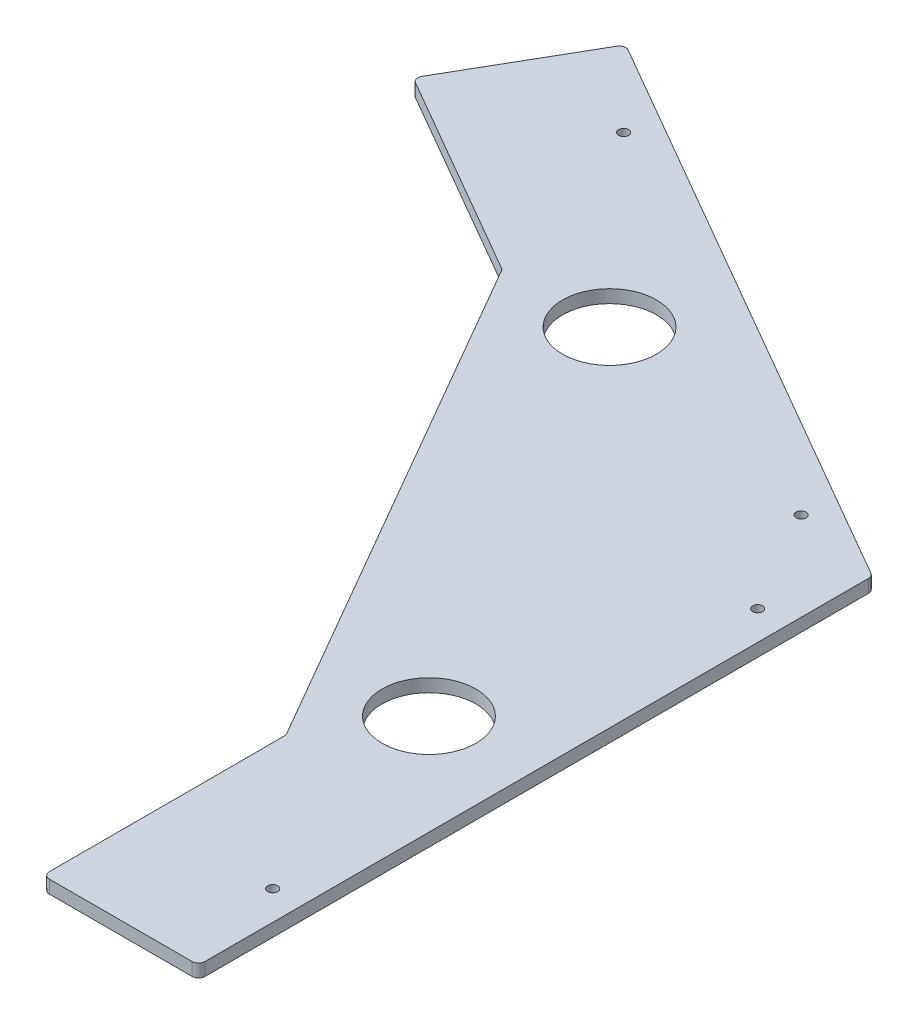
ISO-10303-21;
HEADER;
FILE_DESCRIPTION(('STEP AP214'),'2;1');
FILE_NAME('part.step','',(''),(''),'','','');
FILE_SCHEMA(('AUTOMOTIVE_DESIGN { 1 0 10303 214 1 1 1 1 }'));
ENDSEC;
DATA;
#1=APPLICATION_CONTEXT('core data for automotive mechanical design processes');
#2=APPLICATION_PROTOCOL_DEFINITION('international standard','automotive_design',2000,#1);
#3=PRODUCT_CONTEXT('',#1,'mechanical');
#4=PRODUCT('Part','Part','',(#3));
#5=PRODUCT_RELATED_PRODUCT_CATEGORY('part','',(#4));
#6=PRODUCT_DEFINITION_FORMATION('','',#4);
#7=PRODUCT_DEFINITION_CONTEXT('part definition',#1,'design');
#8=PRODUCT_DEFINITION('design','',#6,#7);
#9=PRODUCT_DEFINITION_SHAPE('','',#8);
#10=(LENGTH_UNIT() NAMED_UNIT(*) SI_UNIT(.MILLI.,.METRE.));
#11=(NAMED_UNIT(*) PLANE_ANGLE_UNIT() SI_UNIT($,.RADIAN.));
#12=(NAMED_UNIT(*) SI_UNIT($,.STERADIAN.) SOLID_ANGLE_UNIT());
#13=UNCERTAINTY_MEASURE_WITH_UNIT(LENGTH_MEASURE(1.E-05),#10,'distance_accuracy_value','');
#14=(GEOMETRIC_REPRESENTATION_CONTEXT(3) GLOBAL_UNCERTAINTY_ASSIGNED_CONTEXT((#13)) GLOBAL_UNIT_ASSIGNED_CONTEXT((#10,
#11,#12)) REPRESENTATION_CONTEXT('',''));
#15=CARTESIAN_POINT('',(0.,0.,0.));
#16=DIRECTION('',(0.,0.,1.));
#17=DIRECTION('',(1.,0.,0.));
#18=AXIS2_PLACEMENT_3D('',#15,#16,#17);
#19=CARTESIAN_POINT('',(0.,6.35,0.));
#20=DIRECTION('',(0.,1.,0.));
#21=DIRECTION('',(0.,0.,1.));
#22=AXIS2_PLACEMENT_3D('',#19,#20,#21);
#23=PLANE('',#22);
#24=CARTESIAN_POINT('',(-43.4068750823877,6.35,-338.518865913276));
#25=DIRECTION('',(0.,1.,0.));
#26=DIRECTION('',(0.,0.,1.));
#27=AXIS2_PLACEMENT_3D('',#24,#25,#26);
#28=CIRCLE('',#27,2.45744999999987);
#29=CARTESIAN_POINT('',(-43.4068750823877,6.35,-336.061415913276));
#30=VERTEX_POINT('',#29);
#31=EDGE_CURVE('E298',#30,#30,#28,.T.);
#32=ORIENTED_EDGE('',*,*,#31,.F.);
#33=EDGE_LOOP('',(#32));
#34=FACE_BOUND('',#33,.T.);
#35=CARTESIAN_POINT('',(-49.2124999999999,6.35,-162.061031219973));
#36=DIRECTION('',(0.,1.,0.));
#37=DIRECTION('',(0.,0.,1.));
#38=AXIS2_PLACEMENT_3D('',#35,#36,#37);
#39=CIRCLE('',#38,23.0187499999997);
#40=CARTESIAN_POINT('',(-49.2124999999999,6.35,-139.042281219974));
#41=VERTEX_POINT('',#40);
#42=EDGE_CURVE('E286',#41,#41,#39,.T.);
#43=ORIENTED_EDGE('',*,*,#42,.F.);
#44=EDGE_LOOP('',(#43));
#45=FACE_BOUND('',#44,.T.);
#46=CARTESIAN_POINT('',(-14.2874999999997,6.35,-50.6078687859258));
#47=DIRECTION('',(0.,1.,0.));
#48=DIRECTION('',(0.,0.,1.));
#49=AXIS2_PLACEMENT_3D('',#46,#47,#48);
#50=CIRCLE('',#49,2.45744999999931);
#51=CARTESIAN_POINT('',(-14.2874999999997,6.35,-48.1504187859265));
#52=VERTEX_POINT('',#51);
#53=EDGE_CURVE('E257',#52,#52,#50,.T.);
#54=ORIENTED_EDGE('',*,*,#53,.F.);
#55=EDGE_LOOP('',(#54));
#56=FACE_BOUND('',#55,.T.);
#57=DIRECTION('',(-0.499999999999996,0.,0.866025403784441));
#58=VECTOR('',#57,1.);
#59=CARTESIAN_POINT('',(-285.750000000001,6.35,-494.933518262806));
#60=LINE('',#59,#58);
#61=CARTESIAN_POINT('',(-287.337500000001,6.35,-492.183887605791));
#62=VERTEX_POINT('',#61);
#63=CARTESIAN_POINT('',(-322.2625,6.35,-431.692013151448));
#64=VERTEX_POINT('',#63);
#65=EDGE_CURVE('E249',#62,#64,#60,.T.);
#66=ORIENTED_EDGE('',*,*,#65,.T.);
#67=CARTESIAN_POINT('',(-319.512869342985,6.35,-430.104513151448));
#68=DIRECTION('',(0.,1.,0.));
#69=DIRECTION('',(0.,0.,1.));
#70=AXIS2_PLACEMENT_3D('',#67,#68,#69);
#71=CIRCLE('',#70,3.175);
#72=CARTESIAN_POINT('',(-321.100369342985,6.35,-427.354882494432));
#73=VERTEX_POINT('',#72);
#74=EDGE_CURVE('E212',#64,#73,#71,.T.);
#75=ORIENTED_EDGE('',*,*,#74,.T.);
#76=DIRECTION('',(0.86602540378444,0.,0.499999999999998));
#77=VECTOR('',#76,1.);
#78=CARTESIAN_POINT('',(-323.85,6.35,-428.942382494432));
#79=LINE('',#78,#77);
#80=CARTESIAN_POINT('',(-221.496872271715,6.35,-369.848776648106));
#81=VERTEX_POINT('',#80);
#82=EDGE_CURVE('E244',#73,#81,#79,.T.);
#83=ORIENTED_EDGE('',*,*,#82,.T.);
#84=CARTESIAN_POINT('',(-223.084372271715,6.35,-367.099145991091));
#85=DIRECTION('',(0.,1.,0.));
#86=DIRECTION('',(0.,0.,1.));
#87=AXIS2_PLACEMENT_3D('',#84,#85,#86);
#88=CIRCLE('',#87,3.175);
#89=CARTESIAN_POINT('',(-220.334741614699,6.35,-368.686645991091));
#90=VERTEX_POINT('',#89);
#91=EDGE_CURVE('E11',#81,#90,#88,.F.);
#92=ORIENTED_EDGE('',*,*,#91,.T.);
#93=DIRECTION('',(0.500000000000001,0.,0.866025403784438));
#94=VECTOR('',#93,1.);
#95=CARTESIAN_POINT('',(-220.760110957684,6.35,-369.423407305122));
#96=LINE('',#95,#94);
#97=CARTESIAN_POINT('',(-76.6253693429844,6.35,-119.774711692651));
#98=VERTEX_POINT('',#97);
#99=EDGE_CURVE('E243',#90,#98,#96,.T.);
#100=ORIENTED_EDGE('',*,*,#99,.T.);
#101=CARTESIAN_POINT('',(-79.375,6.35,-118.187211692651));
#102=DIRECTION('',(0.,1.,0.));
#103=DIRECTION('',(0.,0.,1.));
#104=AXIS2_PLACEMENT_3D('',#101,#102,#103);
#105=CIRCLE('',#104,3.175);
#106=CARTESIAN_POINT('',(-76.2,6.35,-118.187211692651));
#107=VERTEX_POINT('',#106);
#108=EDGE_CURVE('E153',#98,#107,#105,.F.);
#109=ORIENTED_EDGE('',*,*,#108,.T.);
#110=DIRECTION('',(0.,0.,1.));
#111=VECTOR('',#110,1.);
#112=CARTESIAN_POINT('',(-76.2,6.35,-119.03795037862));
#113=LINE('',#112,#111);
#114=CARTESIAN_POINT('',(-76.2,6.35,-3.175));
#115=VERTEX_POINT('',#114);
#116=EDGE_CURVE('E163',#107,#115,#113,.T.);
#117=ORIENTED_EDGE('',*,*,#116,.T.);
#118=CARTESIAN_POINT('',(-73.025,6.35,-3.175));
#119=DIRECTION('',(0.,1.,0.));
#120=DIRECTION('',(0.,0.,1.));
#121=AXIS2_PLACEMENT_3D('',#118,#119,#120);
#122=CIRCLE('',#121,3.175);
#123=CARTESIAN_POINT('',(-73.025,6.35,0.));
#124=VERTEX_POINT('',#123);
#125=EDGE_CURVE('E205',#115,#124,#122,.T.);
#126=ORIENTED_EDGE('',*,*,#125,.T.);
#127=DIRECTION('',(1.,0.,0.));
#128=VECTOR('',#127,1.);
#129=CARTESIAN_POINT('',(-76.2,6.35,0.));
#130=LINE('',#129,#128);
#131=CARTESIAN_POINT('',(-3.17500000000003,6.35,0.));
#132=VERTEX_POINT('',#131);
#133=EDGE_CURVE('E172',#124,#132,#130,.T.);
#134=ORIENTED_EDGE('',*,*,#133,.T.);
#135=CARTESIAN_POINT('',(-3.175,6.35,-3.175));
#136=DIRECTION('',(0.,1.,0.));
#137=DIRECTION('',(0.,0.,1.));
#138=AXIS2_PLACEMENT_3D('',#135,#136,#137);
#139=CIRCLE('',#138,3.175);
#140=CARTESIAN_POINT('',(0.,6.35,-3.175));
#141=VERTEX_POINT('',#140);
#142=EDGE_CURVE('E207',#132,#141,#139,.T.);
#143=ORIENTED_EDGE('',*,*,#142,.T.);
#144=DIRECTION('',(0.,0.,-1.));
#145=VECTOR('',#144,1.);
#146=CARTESIAN_POINT('',(0.,6.35,0.));
#147=LINE('',#146,#145);
#148=CARTESIAN_POINT('',(0.,6.35,-328.122591737194));
#149=VERTEX_POINT('',#148);
#150=EDGE_CURVE('E176',#141,#149,#147,.T.);
#151=ORIENTED_EDGE('',*,*,#150,.T.);
#152=CARTESIAN_POINT('',(-3.175,6.35,-328.122591737194));
#153=DIRECTION('',(0.,1.,0.));
#154=DIRECTION('',(0.,0.,1.));
#155=AXIS2_PLACEMENT_3D('',#152,#153,#154);
#156=CIRCLE('',#155,3.175);
#157=CARTESIAN_POINT('',(-1.58750000000003,6.35,-330.87222239421));
#158=VERTEX_POINT('',#157);
#159=EDGE_CURVE('E63',#149,#158,#156,.T.);
#160=ORIENTED_EDGE('',*,*,#159,.T.);
#161=DIRECTION('',(-0.86602540378444,0.,-0.499999999999998));
#162=VECTOR('',#161,1.);
#163=CARTESIAN_POINT('',(0.,6.35,-329.955678841871));
#164=LINE('',#163,#162);
#165=CARTESIAN_POINT('',(-283.000369342985,6.35,-493.346018262806));
#166=VERTEX_POINT('',#165);
#167=EDGE_CURVE('E273',#158,#166,#164,.T.);
#168=ORIENTED_EDGE('',*,*,#167,.T.);
#169=CARTESIAN_POINT('',(-284.587869342985,6.35,-490.596387605791));
#170=DIRECTION('',(0.,1.,0.));
#171=DIRECTION('',(0.,0.,1.));
#172=AXIS2_PLACEMENT_3D('',#169,#170,#171);
#173=CIRCLE('',#172,3.175);
#174=EDGE_CURVE('E210',#166,#62,#173,.T.);
#175=ORIENTED_EDGE('',*,*,#174,.T.);
#176=EDGE_LOOP('',(#66,#75,#83,#92,#100,#109,#117,#126,#134,#143,#151,#160,#168,#175));
#177=FACE_BOUND('',#176,.T.);
#178=CARTESIAN_POINT('',(-14.2875,6.35,-288.082628785925));
#179=DIRECTION('',(0.,1.,0.));
#180=DIRECTION('',(0.,0.,1.));
#181=AXIS2_PLACEMENT_3D('',#178,#179,#180);
#182=CIRCLE('',#181,2.45744999999968);
#183=CARTESIAN_POINT('',(-14.2875,6.35,-285.625178785926));
#184=VERTEX_POINT('',#183);
#185=EDGE_CURVE('E280',#184,#184,#182,.T.);
#186=ORIENTED_EDGE('',*,*,#185,.F.);
#187=EDGE_LOOP('',(#186));
#188=FACE_BOUND('',#187,.T.);
#189=CARTESIAN_POINT('',(-170.00728,6.35,-371.283727469078));
#190=DIRECTION('',(0.,1.,0.));
#191=DIRECTION('',(0.,0.,1.));
#192=AXIS2_PLACEMENT_3D('',#189,#190,#191);
#193=CIRCLE('',#192,23.01875);
#194=CARTESIAN_POINT('',(-170.00728,6.35,-348.264977469078));
#195=VERTEX_POINT('',#194);
#196=EDGE_CURVE('E292',#195,#195,#193,.T.);
#197=ORIENTED_EDGE('',*,*,#196,.F.);
#198=EDGE_LOOP('',(#197));
#199=FACE_BOUND('',#198,.T.);
#200=CARTESIAN_POINT('',(-249.066050000001,6.35,-457.256245913275));
#201=DIRECTION('',(0.,1.,0.));
#202=DIRECTION('',(0.,0.,1.));
#203=AXIS2_PLACEMENT_3D('',#200,#201,#202);
#204=CIRCLE('',#203,2.45745000000076);
#205=CARTESIAN_POINT('',(-249.066050000001,6.35,-454.798795913274));
#206=VERTEX_POINT('',#205);
#207=EDGE_CURVE('E304',#206,#206,#204,.T.);
#208=ORIENTED_EDGE('',*,*,#207,.F.);
#209=EDGE_LOOP('',(#208));
#210=FACE_BOUND('',#209,.T.);
#211=ADVANCED_FACE('F41',(#34,#45,#56,#177,#188,#199,#210),#23,.T.);
#212=CARTESIAN_POINT('',(0.,0.,0.));
#213=DIRECTION('',(0.,1.,0.));
#214=DIRECTION('',(0.,0.,1.));
#215=AXIS2_PLACEMENT_3D('',#212,#213,#214);
#216=PLANE('',#215);
#217=DIRECTION('',(0.86602540378444,0.,0.499999999999998));
#218=VECTOR('',#217,1.);
#219=CARTESIAN_POINT('',(-323.85,0.,-428.942382494432));
#220=LINE('',#219,#218);
#221=CARTESIAN_POINT('',(-321.100369342985,0.,-427.354882494432));
#222=VERTEX_POINT('',#221);
#223=CARTESIAN_POINT('',(-221.496872271715,0.,-369.848776648106));
#224=VERTEX_POINT('',#223);
#225=EDGE_CURVE('E178',#222,#224,#220,.T.);
#226=ORIENTED_EDGE('',*,*,#225,.F.);
#227=CARTESIAN_POINT('',(-319.512869342985,0.,-430.104513151448));
#228=DIRECTION('',(0.,1.,0.));
#229=DIRECTION('',(0.,0.,1.));
#230=AXIS2_PLACEMENT_3D('',#227,#228,#229);
#231=CIRCLE('',#230,3.175);
#232=CARTESIAN_POINT('',(-322.2625,0.,-431.692013151448));
#233=VERTEX_POINT('',#232);
#234=EDGE_CURVE('E198',#222,#233,#231,.F.);
#235=ORIENTED_EDGE('',*,*,#234,.T.);
#236=DIRECTION('',(-0.499999999999996,0.,0.866025403784441));
#237=VECTOR('',#236,1.);
#238=CARTESIAN_POINT('',(-285.750000000001,0.,-494.933518262806));
#239=LINE('',#238,#237);
#240=CARTESIAN_POINT('',(-287.337500000001,0.,-492.183887605791));
#241=VERTEX_POINT('',#240);
#242=EDGE_CURVE('E236',#241,#233,#239,.T.);
#243=ORIENTED_EDGE('',*,*,#242,.F.);
#244=CARTESIAN_POINT('',(-284.587869342985,0.,-490.596387605791));
#245=DIRECTION('',(0.,1.,0.));
#246=DIRECTION('',(0.,0.,1.));
#247=AXIS2_PLACEMENT_3D('',#244,#245,#246);
#248=CIRCLE('',#247,3.175);
#249=CARTESIAN_POINT('',(-283.000369342985,0.,-493.346018262806));
#250=VERTEX_POINT('',#249);
#251=EDGE_CURVE('E196',#241,#250,#248,.F.);
#252=ORIENTED_EDGE('',*,*,#251,.T.);
#253=DIRECTION('',(-0.86602540378444,0.,-0.499999999999998));
#254=VECTOR('',#253,1.);
#255=CARTESIAN_POINT('',(0.,0.,-329.955678841871));
#256=LINE('',#255,#254);
#257=CARTESIAN_POINT('',(-1.58750000000003,0.,-330.87222239421));
#258=VERTEX_POINT('',#257);
#259=EDGE_CURVE('E260',#258,#250,#256,.T.);
#260=ORIENTED_EDGE('',*,*,#259,.F.);
#261=CARTESIAN_POINT('',(-3.175,0.,-328.122591737194));
#262=DIRECTION('',(0.,1.,0.));
#263=DIRECTION('',(0.,0.,1.));
#264=AXIS2_PLACEMENT_3D('',#261,#262,#263);
#265=CIRCLE('',#264,3.175);
#266=CARTESIAN_POINT('',(0.,0.,-328.122591737194));
#267=VERTEX_POINT('',#266);
#268=EDGE_CURVE('E194',#258,#267,#265,.F.);
#269=ORIENTED_EDGE('',*,*,#268,.T.);
#270=DIRECTION('',(0.,0.,-1.));
#271=VECTOR('',#270,1.);
#272=CARTESIAN_POINT('',(0.,0.,0.));
#273=LINE('',#272,#271);
#274=CARTESIAN_POINT('',(0.,0.,-3.175));
#275=VERTEX_POINT('',#274);
#276=EDGE_CURVE('E256',#275,#267,#273,.T.);
#277=ORIENTED_EDGE('',*,*,#276,.F.);
#278=CARTESIAN_POINT('',(-3.175,0.,-3.175));
#279=DIRECTION('',(0.,1.,0.));
#280=DIRECTION('',(0.,0.,1.));
#281=AXIS2_PLACEMENT_3D('',#278,#279,#280);
#282=CIRCLE('',#281,3.175);
#283=CARTESIAN_POINT('',(-3.17500000000003,0.,0.));
#284=VERTEX_POINT('',#283);
#285=EDGE_CURVE('E192',#275,#284,#282,.F.);
#286=ORIENTED_EDGE('',*,*,#285,.T.);
#287=DIRECTION('',(1.,0.,0.));
#288=VECTOR('',#287,1.);
#289=CARTESIAN_POINT('',(-76.2,0.,0.));
#290=LINE('',#289,#288);
#291=CARTESIAN_POINT('',(-73.025,0.,0.));
#292=VERTEX_POINT('',#291);
#293=EDGE_CURVE('E253',#292,#284,#290,.T.);
#294=ORIENTED_EDGE('',*,*,#293,.F.);
#295=CARTESIAN_POINT('',(-73.025,0.,-3.175));
#296=DIRECTION('',(0.,1.,0.));
#297=DIRECTION('',(0.,0.,1.));
#298=AXIS2_PLACEMENT_3D('',#295,#296,#297);
#299=CIRCLE('',#298,3.175);
#300=CARTESIAN_POINT('',(-76.2,0.,-3.175));
#301=VERTEX_POINT('',#300);
#302=EDGE_CURVE('E171',#292,#301,#299,.F.);
#303=ORIENTED_EDGE('',*,*,#302,.T.);
#304=DIRECTION('',(0.,0.,1.));
#305=VECTOR('',#304,1.);
#306=CARTESIAN_POINT('',(-76.2,0.,-119.03795037862));
#307=LINE('',#306,#305);
#308=CARTESIAN_POINT('',(-76.2,0.,-118.187211692651));
#309=VERTEX_POINT('',#308);
#310=EDGE_CURVE('E160',#309,#301,#307,.T.);
#311=ORIENTED_EDGE('',*,*,#310,.F.);
#312=CARTESIAN_POINT('',(-79.375,0.,-118.187211692651));
#313=DIRECTION('',(0.,1.,0.));
#314=DIRECTION('',(0.,0.,1.));
#315=AXIS2_PLACEMENT_3D('',#312,#313,#314);
#316=CIRCLE('',#315,3.175);
#317=CARTESIAN_POINT('',(-76.6253693429844,0.,-119.774711692651));
#318=VERTEX_POINT('',#317);
#319=EDGE_CURVE('E143',#309,#318,#316,.T.);
#320=ORIENTED_EDGE('',*,*,#319,.T.);
#321=DIRECTION('',(0.500000000000001,0.,0.866025403784438));
#322=VECTOR('',#321,1.);
#323=CARTESIAN_POINT('',(-220.760110957684,0.,-369.423407305122));
#324=LINE('',#323,#322);
#325=CARTESIAN_POINT('',(-220.334741614699,0.,-368.686645991091));
#326=VERTEX_POINT('',#325);
#327=EDGE_CURVE('E173',#326,#318,#324,.T.);
#328=ORIENTED_EDGE('',*,*,#327,.F.);
#329=CARTESIAN_POINT('',(-223.084372271715,0.,-367.099145991091));
#330=DIRECTION('',(0.,1.,0.));
#331=DIRECTION('',(0.,0.,1.));
#332=AXIS2_PLACEMENT_3D('',#329,#330,#331);
#333=CIRCLE('',#332,3.175);
#334=EDGE_CURVE('E49',#326,#224,#333,.T.);
#335=ORIENTED_EDGE('',*,*,#334,.T.);
#336=EDGE_LOOP('',(#226,#235,#243,#252,#260,#269,#277,#286,#294,#303,#311,#320,#328,#335));
#337=FACE_BOUND('',#336,.T.);
#338=CARTESIAN_POINT('',(-14.2874999999997,0.,-50.6078687859258));
#339=DIRECTION('',(0.,1.,0.));
#340=DIRECTION('',(0.,0.,1.));
#341=AXIS2_PLACEMENT_3D('',#338,#339,#340);
#342=CIRCLE('',#341,2.45744999999931);
#343=CARTESIAN_POINT('',(-14.2874999999997,0.,-48.1504187859265));
#344=VERTEX_POINT('',#343);
#345=EDGE_CURVE('E277',#344,#344,#342,.T.);
#346=ORIENTED_EDGE('',*,*,#345,.T.);
#347=EDGE_LOOP('',(#346));
#348=FACE_BOUND('',#347,.T.);
#349=CARTESIAN_POINT('',(-14.2875,0.,-288.082628785925));
#350=DIRECTION('',(0.,1.,0.));
#351=DIRECTION('',(0.,0.,1.));
#352=AXIS2_PLACEMENT_3D('',#349,#350,#351);
#353=CIRCLE('',#352,2.45744999999968);
#354=CARTESIAN_POINT('',(-14.2875,0.,-285.625178785926));
#355=VERTEX_POINT('',#354);
#356=EDGE_CURVE('E283',#355,#355,#353,.T.);
#357=ORIENTED_EDGE('',*,*,#356,.T.);
#358=EDGE_LOOP('',(#357));
#359=FACE_BOUND('',#358,.T.);
#360=CARTESIAN_POINT('',(-49.2124999999999,0.,-162.061031219973));
#361=DIRECTION('',(0.,1.,0.));
#362=DIRECTION('',(0.,0.,1.));
#363=AXIS2_PLACEMENT_3D('',#360,#361,#362);
#364=CIRCLE('',#363,23.0187499999997);
#365=CARTESIAN_POINT('',(-49.2124999999999,0.,-139.042281219974));
#366=VERTEX_POINT('',#365);
#367=EDGE_CURVE('E289',#366,#366,#364,.T.);
#368=ORIENTED_EDGE('',*,*,#367,.T.);
#369=EDGE_LOOP('',(#368));
#370=FACE_BOUND('',#369,.T.);
#371=CARTESIAN_POINT('',(-170.00728,0.,-371.283727469078));
#372=DIRECTION('',(0.,1.,0.));
#373=DIRECTION('',(0.,0.,1.));
#374=AXIS2_PLACEMENT_3D('',#371,#372,#373);
#375=CIRCLE('',#374,23.01875);
#376=CARTESIAN_POINT('',(-170.00728,0.,-348.264977469078));
#377=VERTEX_POINT('',#376);
#378=EDGE_CURVE('E295',#377,#377,#375,.T.);
#379=ORIENTED_EDGE('',*,*,#378,.T.);
#380=EDGE_LOOP('',(#379));
#381=FACE_BOUND('',#380,.T.);
#382=CARTESIAN_POINT('',(-43.4068750823877,0.,-338.518865913276));
#383=DIRECTION('',(0.,1.,0.));
#384=DIRECTION('',(0.,0.,1.));
#385=AXIS2_PLACEMENT_3D('',#382,#383,#384);
#386=CIRCLE('',#385,2.45744999999987);
#387=CARTESIAN_POINT('',(-43.4068750823877,0.,-336.061415913276));
#388=VERTEX_POINT('',#387);
#389=EDGE_CURVE('E301',#388,#388,#386,.T.);
#390=ORIENTED_EDGE('',*,*,#389,.T.);
#391=EDGE_LOOP('',(#390));
#392=FACE_BOUND('',#391,.T.);
#393=CARTESIAN_POINT('',(-249.066050000001,0.,-457.256245913275));
#394=DIRECTION('',(0.,1.,0.));
#395=DIRECTION('',(0.,0.,1.));
#396=AXIS2_PLACEMENT_3D('',#393,#394,#395);
#397=CIRCLE('',#396,2.45745000000076);
#398=CARTESIAN_POINT('',(-249.066050000001,0.,-454.798795913274));
#399=VERTEX_POINT('',#398);
#400=EDGE_CURVE('E307',#399,#399,#397,.T.);
#401=ORIENTED_EDGE('',*,*,#400,.T.);
#402=EDGE_LOOP('',(#401));
#403=FACE_BOUND('',#402,.T.);
#404=ADVANCED_FACE('F168',(#337,#348,#359,#370,#381,#392,#403),#216,.F.);
#405=CARTESIAN_POINT('',(-76.2,6.35,0.));
#406=DIRECTION('',(0.,0.,-1.));
#407=DIRECTION('',(-1.,0.,0.));
#408=AXIS2_PLACEMENT_3D('',#405,#406,#407);
#409=PLANE('',#408);
#410=ORIENTED_EDGE('',*,*,#293,.T.);
#411=DIRECTION('',(0.,-1.,0.));
#412=VECTOR('',#411,1.);
#413=CARTESIAN_POINT('',(-3.175,6.35,0.));
#414=LINE('',#413,#412);
#415=EDGE_CURVE('E154',#284,#132,#414,.F.);
#416=ORIENTED_EDGE('',*,*,#415,.T.);
#417=ORIENTED_EDGE('',*,*,#133,.F.);
#418=DIRECTION('',(0.,-1.,0.));
#419=VECTOR('',#418,1.);
#420=CARTESIAN_POINT('',(-73.025,6.35,0.));
#421=LINE('',#420,#419);
#422=EDGE_CURVE('E223',#124,#292,#421,.T.);
#423=ORIENTED_EDGE('',*,*,#422,.T.);
#424=EDGE_LOOP('',(#410,#416,#417,#423));
#425=FACE_BOUND('',#424,.T.);
#426=ADVANCED_FACE('F323',(#425),#409,.F.);
#427=CARTESIAN_POINT('',(0.,6.35,0.));
#428=DIRECTION('',(-1.,0.,0.));
#429=DIRECTION('',(0.,0.,1.));
#430=AXIS2_PLACEMENT_3D('',#427,#428,#429);
#431=PLANE('',#430);
#432=ORIENTED_EDGE('',*,*,#276,.T.);
#433=DIRECTION('',(0.,-1.,0.));
#434=VECTOR('',#433,1.);
#435=CARTESIAN_POINT('',(0.,6.35,-328.122591737194));
#436=LINE('',#435,#434);
#437=EDGE_CURVE('E221',#267,#149,#436,.F.);
#438=ORIENTED_EDGE('',*,*,#437,.T.);
#439=ORIENTED_EDGE('',*,*,#150,.F.);
#440=DIRECTION('',(0.,-1.,0.));
#441=VECTOR('',#440,1.);
#442=CARTESIAN_POINT('',(0.,6.35,-3.175));
#443=LINE('',#442,#441);
#444=EDGE_CURVE('E218',#141,#275,#443,.T.);
#445=ORIENTED_EDGE('',*,*,#444,.T.);
#446=EDGE_LOOP('',(#432,#438,#439,#445));
#447=FACE_BOUND('',#446,.T.);
#448=ADVANCED_FACE('F342',(#447),#431,.F.);
#449=CARTESIAN_POINT('',(0.,6.35,-329.955678841871));
#450=DIRECTION('',(-0.499999999999998,0.,0.86602540378444));
#451=DIRECTION('',(0.86602540378444,0.,0.499999999999998));
#452=AXIS2_PLACEMENT_3D('',#449,#450,#451);
#453=PLANE('',#452);
#454=ORIENTED_EDGE('',*,*,#259,.T.);
#455=DIRECTION('',(0.,-1.,0.));
#456=VECTOR('',#455,1.);
#457=CARTESIAN_POINT('',(-283.000369342985,6.35,-493.346018262806));
#458=LINE('',#457,#456);
#459=EDGE_CURVE('E56',#250,#166,#458,.F.);
#460=ORIENTED_EDGE('',*,*,#459,.T.);
#461=ORIENTED_EDGE('',*,*,#167,.F.);
#462=DIRECTION('',(0.,-1.,0.));
#463=VECTOR('',#462,1.);
#464=CARTESIAN_POINT('',(-1.58750000000002,6.35,-330.87222239421));
#465=LINE('',#464,#463);
#466=EDGE_CURVE('E214',#158,#258,#465,.T.);
#467=ORIENTED_EDGE('',*,*,#466,.T.);
#468=EDGE_LOOP('',(#454,#460,#461,#467));
#469=FACE_BOUND('',#468,.T.);
#470=ADVANCED_FACE('F339',(#469),#453,.F.);
#471=CARTESIAN_POINT('',(-285.750000000001,6.35,-494.933518262806));
#472=DIRECTION('',(0.866025403784441,0.,0.499999999999996));
#473=DIRECTION('',(0.499999999999996,0.,-0.866025403784441));
#474=AXIS2_PLACEMENT_3D('',#471,#472,#473);
#475=PLANE('',#474);
#476=ORIENTED_EDGE('',*,*,#242,.T.);
#477=DIRECTION('',(0.,-1.,0.));
#478=VECTOR('',#477,1.);
#479=CARTESIAN_POINT('',(-322.2625,6.35,-431.692013151448));
#480=LINE('',#479,#478);
#481=EDGE_CURVE('E203',#233,#64,#480,.F.);
#482=ORIENTED_EDGE('',*,*,#481,.T.);
#483=ORIENTED_EDGE('',*,*,#65,.F.);
#484=DIRECTION('',(0.,-1.,0.));
#485=VECTOR('',#484,1.);
#486=CARTESIAN_POINT('',(-287.337500000001,6.35,-492.183887605791));
#487=LINE('',#486,#485);
#488=EDGE_CURVE('E200',#62,#241,#487,.T.);
#489=ORIENTED_EDGE('',*,*,#488,.T.);
#490=EDGE_LOOP('',(#476,#482,#483,#489));
#491=FACE_BOUND('',#490,.T.);
#492=ADVANCED_FACE('F266',(#491),#475,.F.);
#493=CARTESIAN_POINT('',(-323.85,6.35,-428.942382494432));
#494=DIRECTION('',(0.499999999999998,0.,-0.86602540378444));
#495=DIRECTION('',(-0.86602540378444,0.,-0.499999999999998));
#496=AXIS2_PLACEMENT_3D('',#493,#494,#495);
#497=PLANE('',#496);
#498=ORIENTED_EDGE('',*,*,#225,.T.);
#499=DIRECTION('',(0.,-1.,0.));
#500=VECTOR('',#499,1.);
#501=CARTESIAN_POINT('',(-221.496872271715,6.35,-369.848776648106));
#502=LINE('',#501,#500);
#503=EDGE_CURVE('E189',#224,#81,#502,.F.);
#504=ORIENTED_EDGE('',*,*,#503,.T.);
#505=ORIENTED_EDGE('',*,*,#82,.F.);
#506=DIRECTION('',(0.,-1.,0.));
#507=VECTOR('',#506,1.);
#508=CARTESIAN_POINT('',(-321.100369342985,6.35,-427.354882494432));
#509=LINE('',#508,#507);
#510=EDGE_CURVE('E186',#73,#222,#509,.T.);
#511=ORIENTED_EDGE('',*,*,#510,.T.);
#512=EDGE_LOOP('',(#498,#504,#505,#511));
#513=FACE_BOUND('',#512,.T.);
#514=ADVANCED_FACE('F232',(#513),#497,.F.);
#515=CARTESIAN_POINT('',(-220.760110957684,6.35,-369.423407305122));
#516=DIRECTION('',(0.866025403784438,0.,-0.500000000000001));
#517=DIRECTION('',(-0.500000000000001,0.,-0.866025403784438));
#518=AXIS2_PLACEMENT_3D('',#515,#516,#517);
#519=PLANE('',#518);
#520=ORIENTED_EDGE('',*,*,#327,.T.);
#521=DIRECTION('',(0.,-1.,0.));
#522=VECTOR('',#521,1.);
#523=CARTESIAN_POINT('',(-76.6253693429844,6.35,-119.774711692651));
#524=LINE('',#523,#522);
#525=EDGE_CURVE('E148',#318,#98,#524,.F.);
#526=ORIENTED_EDGE('',*,*,#525,.T.);
#527=ORIENTED_EDGE('',*,*,#99,.F.);
#528=DIRECTION('',(0.,-1.,0.));
#529=VECTOR('',#528,1.);
#530=CARTESIAN_POINT('',(-220.334741614699,0.,-368.686645991091));
#531=LINE('',#530,#529);
#532=EDGE_CURVE('E164',#90,#326,#531,.T.);
#533=ORIENTED_EDGE('',*,*,#532,.T.);
#534=EDGE_LOOP('',(#520,#526,#527,#533));
#535=FACE_BOUND('',#534,.T.);
#536=ADVANCED_FACE('F246',(#535),#519,.F.);
#537=CARTESIAN_POINT('',(-76.2,6.35,-119.03795037862));
#538=DIRECTION('',(1.,0.,0.));
#539=DIRECTION('',(0.,0.,-1.));
#540=AXIS2_PLACEMENT_3D('',#537,#538,#539);
#541=PLANE('',#540);
#542=ORIENTED_EDGE('',*,*,#116,.F.);
#543=DIRECTION('',(0.,-1.,0.));
#544=VECTOR('',#543,1.);
#545=CARTESIAN_POINT('',(-76.2,0.,-118.187211692651));
#546=LINE('',#545,#544);
#547=EDGE_CURVE('E147',#107,#309,#546,.T.);
#548=ORIENTED_EDGE('',*,*,#547,.T.);
#549=ORIENTED_EDGE('',*,*,#310,.T.);
#550=DIRECTION('',(0.,-1.,0.));
#551=VECTOR('',#550,1.);
#552=CARTESIAN_POINT('',(-76.2,6.35,-3.175));
#553=LINE('',#552,#551);
#554=EDGE_CURVE('E165',#301,#115,#553,.F.);
#555=ORIENTED_EDGE('',*,*,#554,.T.);
#556=EDGE_LOOP('',(#542,#548,#549,#555));
#557=FACE_BOUND('',#556,.T.);
#558=ADVANCED_FACE('F159',(#557),#541,.F.);
#559=CARTESIAN_POINT('',(-14.2874999999997,6.35,-50.6078687859258));
#560=DIRECTION('',(0.,-1.,0.));
#561=DIRECTION('',(0.,0.,-1.));
#562=AXIS2_PLACEMENT_3D('',#559,#560,#561);
#563=CYLINDRICAL_SURFACE('',#562,2.45744999999931);
#564=ORIENTED_EDGE('',*,*,#53,.T.);
#565=EDGE_LOOP('',(#564));
#566=FACE_BOUND('',#565,.T.);
#567=ORIENTED_EDGE('',*,*,#345,.F.);
#568=EDGE_LOOP('',(#567));
#569=FACE_BOUND('',#568,.T.);
#570=ADVANCED_FACE('F328',(#566,#569),#563,.F.);
#571=CARTESIAN_POINT('',(-14.2875,6.35,-288.082628785925));
#572=DIRECTION('',(0.,-1.,0.));
#573=DIRECTION('',(0.,0.,-1.));
#574=AXIS2_PLACEMENT_3D('',#571,#572,#573);
#575=CYLINDRICAL_SURFACE('',#574,2.45744999999968);
#576=ORIENTED_EDGE('',*,*,#185,.T.);
#577=EDGE_LOOP('',(#576));
#578=FACE_BOUND('',#577,.T.);
#579=ORIENTED_EDGE('',*,*,#356,.F.);
#580=EDGE_LOOP('',(#579));
#581=FACE_BOUND('',#580,.T.);
#582=ADVANCED_FACE('F433',(#578,#581),#575,.F.);
#583=CARTESIAN_POINT('',(-49.2124999999999,6.35,-162.061031219973));
#584=DIRECTION('',(0.,-1.,0.));
#585=DIRECTION('',(0.,0.,-1.));
#586=AXIS2_PLACEMENT_3D('',#583,#584,#585);
#587=CYLINDRICAL_SURFACE('',#586,23.0187499999997);
#588=ORIENTED_EDGE('',*,*,#42,.T.);
#589=EDGE_LOOP('',(#588));
#590=FACE_BOUND('',#589,.T.);
#591=ORIENTED_EDGE('',*,*,#367,.F.);
#592=EDGE_LOOP('',(#591));
#593=FACE_BOUND('',#592,.T.);
#594=ADVANCED_FACE('F425',(#590,#593),#587,.F.);
#595=CARTESIAN_POINT('',(-170.00728,6.35,-371.283727469078));
#596=DIRECTION('',(0.,-1.,0.));
#597=DIRECTION('',(0.,0.,-1.));
#598=AXIS2_PLACEMENT_3D('',#595,#596,#597);
#599=CYLINDRICAL_SURFACE('',#598,23.01875);
#600=ORIENTED_EDGE('',*,*,#196,.T.);
#601=EDGE_LOOP('',(#600));
#602=FACE_BOUND('',#601,.T.);
#603=ORIENTED_EDGE('',*,*,#378,.F.);
#604=EDGE_LOOP('',(#603));
#605=FACE_BOUND('',#604,.T.);
#606=ADVANCED_FACE('F417',(#602,#605),#599,.F.);
#607=CARTESIAN_POINT('',(-43.4068750823877,6.35,-338.518865913276));
#608=DIRECTION('',(0.,-1.,0.));
#609=DIRECTION('',(0.,0.,-1.));
#610=AXIS2_PLACEMENT_3D('',#607,#608,#609);
#611=CYLINDRICAL_SURFACE('',#610,2.45744999999987);
#612=ORIENTED_EDGE('',*,*,#31,.T.);
#613=EDGE_LOOP('',(#612));
#614=FACE_BOUND('',#613,.T.);
#615=ORIENTED_EDGE('',*,*,#389,.F.);
#616=EDGE_LOOP('',(#615));
#617=FACE_BOUND('',#616,.T.);
#618=ADVANCED_FACE('F410',(#614,#617),#611,.F.);
#619=CARTESIAN_POINT('',(-249.066050000001,6.35,-457.256245913275));
#620=DIRECTION('',(0.,-1.,0.));
#621=DIRECTION('',(0.,0.,-1.));
#622=AXIS2_PLACEMENT_3D('',#619,#620,#621);
#623=CYLINDRICAL_SURFACE('',#622,2.45745000000076);
#624=ORIENTED_EDGE('',*,*,#207,.T.);
#625=EDGE_LOOP('',(#624));
#626=FACE_BOUND('',#625,.T.);
#627=ORIENTED_EDGE('',*,*,#400,.F.);
#628=EDGE_LOOP('',(#627));
#629=FACE_BOUND('',#628,.T.);
#630=ADVANCED_FACE('F313',(#626,#629),#623,.F.);
#631=CARTESIAN_POINT('',(-79.375,6.35,-118.187211692651));
#632=DIRECTION('',(0.,1.,0.));
#633=DIRECTION('',(0.,0.,1.));
#634=AXIS2_PLACEMENT_3D('',#631,#632,#633);
#635=CYLINDRICAL_SURFACE('',#634,3.175);
#636=ORIENTED_EDGE('',*,*,#108,.F.);
#637=ORIENTED_EDGE('',*,*,#525,.F.);
#638=ORIENTED_EDGE('',*,*,#319,.F.);
#639=ORIENTED_EDGE('',*,*,#547,.F.);
#640=EDGE_LOOP('',(#636,#637,#638,#639));
#641=FACE_BOUND('',#640,.T.);
#642=ADVANCED_FACE('F146',(#641),#635,.F.);
#643=CARTESIAN_POINT('',(-223.084372271715,6.35,-367.099145991091));
#644=DIRECTION('',(0.,1.,0.));
#645=DIRECTION('',(0.,0.,1.));
#646=AXIS2_PLACEMENT_3D('',#643,#644,#645);
#647=CYLINDRICAL_SURFACE('',#646,3.175);
#648=ORIENTED_EDGE('',*,*,#91,.F.);
#649=ORIENTED_EDGE('',*,*,#503,.F.);
#650=ORIENTED_EDGE('',*,*,#334,.F.);
#651=ORIENTED_EDGE('',*,*,#532,.F.);
#652=EDGE_LOOP('',(#648,#649,#650,#651));
#653=FACE_BOUND('',#652,.T.);
#654=ADVANCED_FACE('F238',(#653),#647,.F.);
#655=CARTESIAN_POINT('',(-319.512869342985,6.35,-430.104513151448));
#656=DIRECTION('',(0.,-1.,0.));
#657=DIRECTION('',(0.,0.,-1.));
#658=AXIS2_PLACEMENT_3D('',#655,#656,#657);
#659=CYLINDRICAL_SURFACE('',#658,3.175);
#660=ORIENTED_EDGE('',*,*,#74,.F.);
#661=ORIENTED_EDGE('',*,*,#481,.F.);
#662=ORIENTED_EDGE('',*,*,#234,.F.);
#663=ORIENTED_EDGE('',*,*,#510,.F.);
#664=EDGE_LOOP('',(#660,#661,#662,#663));
#665=FACE_BOUND('',#664,.T.);
#666=ADVANCED_FACE('F271',(#665),#659,.T.);
#667=CARTESIAN_POINT('',(-284.587869342985,6.35,-490.596387605791));
#668=DIRECTION('',(0.,-1.,0.));
#669=DIRECTION('',(0.,0.,-1.));
#670=AXIS2_PLACEMENT_3D('',#667,#668,#669);
#671=CYLINDRICAL_SURFACE('',#670,3.175);
#672=ORIENTED_EDGE('',*,*,#174,.F.);
#673=ORIENTED_EDGE('',*,*,#459,.F.);
#674=ORIENTED_EDGE('',*,*,#251,.F.);
#675=ORIENTED_EDGE('',*,*,#488,.F.);
#676=EDGE_LOOP('',(#672,#673,#674,#675));
#677=FACE_BOUND('',#676,.T.);
#678=ADVANCED_FACE('F355',(#677),#671,.T.);
#679=CARTESIAN_POINT('',(-3.175,6.35,-328.122591737194));
#680=DIRECTION('',(0.,-1.,0.));
#681=DIRECTION('',(0.,0.,-1.));
#682=AXIS2_PLACEMENT_3D('',#679,#680,#681);
#683=CYLINDRICAL_SURFACE('',#682,3.175);
#684=ORIENTED_EDGE('',*,*,#159,.F.);
#685=ORIENTED_EDGE('',*,*,#437,.F.);
#686=ORIENTED_EDGE('',*,*,#268,.F.);
#687=ORIENTED_EDGE('',*,*,#466,.F.);
#688=EDGE_LOOP('',(#684,#685,#686,#687));
#689=FACE_BOUND('',#688,.T.);
#690=ADVANCED_FACE('F358',(#689),#683,.T.);
#691=CARTESIAN_POINT('',(-3.175,6.35,-3.175));
#692=DIRECTION('',(0.,-1.,0.));
#693=DIRECTION('',(0.,0.,-1.));
#694=AXIS2_PLACEMENT_3D('',#691,#692,#693);
#695=CYLINDRICAL_SURFACE('',#694,3.175);
#696=ORIENTED_EDGE('',*,*,#142,.F.);
#697=ORIENTED_EDGE('',*,*,#415,.F.);
#698=ORIENTED_EDGE('',*,*,#285,.F.);
#699=ORIENTED_EDGE('',*,*,#444,.F.);
#700=EDGE_LOOP('',(#696,#697,#698,#699));
#701=FACE_BOUND('',#700,.T.);
#702=ADVANCED_FACE('F361',(#701),#695,.T.);
#703=CARTESIAN_POINT('',(-73.025,6.35,-3.175));
#704=DIRECTION('',(0.,-1.,0.));
#705=DIRECTION('',(0.,0.,-1.));
#706=AXIS2_PLACEMENT_3D('',#703,#704,#705);
#707=CYLINDRICAL_SURFACE('',#706,3.175);
#708=ORIENTED_EDGE('',*,*,#125,.F.);
#709=ORIENTED_EDGE('',*,*,#554,.F.);
#710=ORIENTED_EDGE('',*,*,#302,.F.);
#711=ORIENTED_EDGE('',*,*,#422,.F.);
#712=EDGE_LOOP('',(#708,#709,#710,#711));
#713=FACE_BOUND('',#712,.T.);
#714=ADVANCED_FACE('F43',(#713),#707,.T.);
#715=CLOSED_SHELL('',(#211,#404,#426,#448,#470,#492,#514,#536,#558,#570,#582,#594,#606,#618,
#630,#642,#654,#666,#678,#690,#702,#714));
#716=MANIFOLD_SOLID_BREP('B2',#715);
#717=ADVANCED_BREP_SHAPE_REPRESENTATION('',(#18,#716),#14);
#718=SHAPE_DEFINITION_REPRESENTATION(#9,#717);
ENDSEC;
END-ISO-10303-21;
